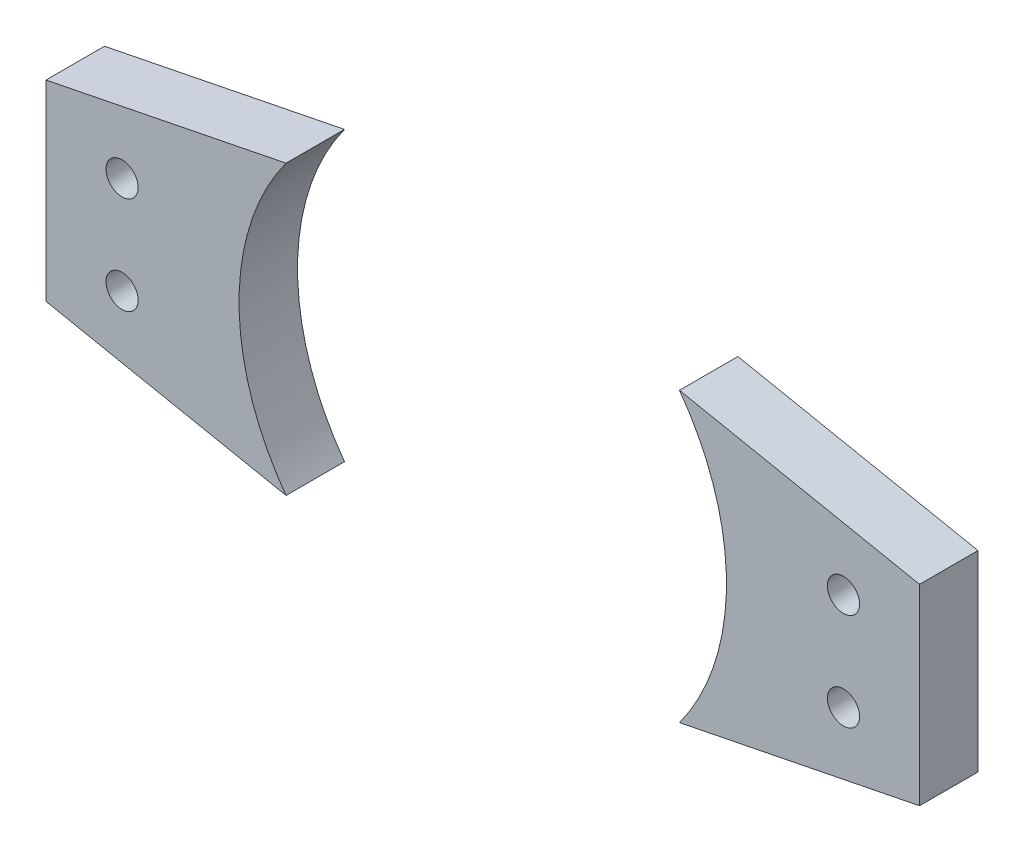
ISO-10303-21;
HEADER;
FILE_DESCRIPTION(('STEP AP214'),'2;1');
FILE_NAME('part.step','',(''),(''),'','','');
FILE_SCHEMA(('AUTOMOTIVE_DESIGN { 1 0 10303 214 1 1 1 1 }'));
ENDSEC;
DATA;
#1=APPLICATION_CONTEXT('core data for automotive mechanical design processes');
#2=APPLICATION_PROTOCOL_DEFINITION('international standard','automotive_design',2000,#1);
#3=PRODUCT_CONTEXT('',#1,'mechanical');
#4=PRODUCT('Part','Part','',(#3));
#5=PRODUCT_RELATED_PRODUCT_CATEGORY('part','',(#4));
#6=PRODUCT_DEFINITION_FORMATION('','',#4);
#7=PRODUCT_DEFINITION_CONTEXT('part definition',#1,'design');
#8=PRODUCT_DEFINITION('design','',#6,#7);
#9=PRODUCT_DEFINITION_SHAPE('','',#8);
#10=(LENGTH_UNIT() NAMED_UNIT(*) SI_UNIT(.MILLI.,.METRE.));
#11=(NAMED_UNIT(*) PLANE_ANGLE_UNIT() SI_UNIT($,.RADIAN.));
#12=(NAMED_UNIT(*) SI_UNIT($,.STERADIAN.) SOLID_ANGLE_UNIT());
#13=UNCERTAINTY_MEASURE_WITH_UNIT(LENGTH_MEASURE(1.E-05),#10,'distance_accuracy_value','');
#14=(GEOMETRIC_REPRESENTATION_CONTEXT(3) GLOBAL_UNCERTAINTY_ASSIGNED_CONTEXT((#13)) GLOBAL_UNIT_ASSIGNED_CONTEXT((#10,
#11,#12)) REPRESENTATION_CONTEXT('',''));
#15=CARTESIAN_POINT('',(0.,0.,0.));
#16=DIRECTION('',(0.,0.,1.));
#17=DIRECTION('',(1.,0.,0.));
#18=AXIS2_PLACEMENT_3D('',#15,#16,#17);
#19=CARTESIAN_POINT('',(15.,-50.,-106.));
#20=DIRECTION('',(0.,0.,-1.));
#21=DIRECTION('',(-1.,0.,0.));
#22=AXIS2_PLACEMENT_3D('',#19,#20,#21);
#23=PLANE('',#22);
#24=CARTESIAN_POINT('',(0.,-50.,-106.));
#25=DIRECTION('',(0.,0.,1.));
#26=DIRECTION('',(1.,0.,0.));
#27=AXIS2_PLACEMENT_3D('',#24,#25,#26);
#28=CIRCLE('',#27,25.);
#29=CARTESIAN_POINT('',(20.177354159453,-64.7605683875657,-106.));
#30=VERTEX_POINT('',#29);
#31=CARTESIAN_POINT('',(20.177354159453,-35.2394316124342,-106.));
#32=VERTEX_POINT('',#31);
#33=EDGE_CURVE('E57',#30,#32,#28,.T.);
#34=ORIENTED_EDGE('',*,*,#33,.T.);
#35=DIRECTION('',(0.98058067569092,-0.196116135138186,0.));
#36=VECTOR('',#35,1.);
#37=CARTESIAN_POINT('',(18.0376998498955,-34.8115007505227,-106.));
#38=LINE('',#37,#36);
#39=CARTESIAN_POINT('',(44.8,-40.1639607805437,-106.));
#40=VERTEX_POINT('',#39);
#41=EDGE_CURVE('E158',#32,#40,#38,.T.);
#42=ORIENTED_EDGE('',*,*,#41,.T.);
#43=DIRECTION('',(0.,-1.,0.));
#44=VECTOR('',#43,1.);
#45=CARTESIAN_POINT('',(44.8,-50.,-106.));
#46=LINE('',#45,#44);
#47=CARTESIAN_POINT('',(44.8,-59.8360392194563,-106.));
#48=VERTEX_POINT('',#47);
#49=EDGE_CURVE('E106',#40,#48,#46,.T.);
#50=ORIENTED_EDGE('',*,*,#49,.T.);
#51=DIRECTION('',(-0.98058067569092,-0.196116135138185,0.));
#52=VECTOR('',#51,1.);
#53=CARTESIAN_POINT('',(18.0376998498955,-65.1884992494772,-106.));
#54=LINE('',#53,#52);
#55=EDGE_CURVE('E114',#48,#30,#54,.T.);
#56=ORIENTED_EDGE('',*,*,#55,.T.);
#57=EDGE_LOOP('',(#34,#42,#50,#56));
#58=FACE_BOUND('',#57,.T.);
#59=CARTESIAN_POINT('',(37.,-55.,-106.));
#60=DIRECTION('',(0.,0.,-1.));
#61=DIRECTION('',(-1.,0.,0.));
#62=AXIS2_PLACEMENT_3D('',#59,#60,#61);
#63=CIRCLE('',#62,1.64999999999997);
#64=CARTESIAN_POINT('',(35.35,-55.,-106.));
#65=VERTEX_POINT('',#64);
#66=EDGE_CURVE('E123',#65,#65,#63,.T.);
#67=ORIENTED_EDGE('',*,*,#66,.F.);
#68=EDGE_LOOP('',(#67));
#69=FACE_BOUND('',#68,.T.);
#70=CARTESIAN_POINT('',(37.,-45.,-106.));
#71=DIRECTION('',(0.,0.,-1.));
#72=DIRECTION('',(-1.,0.,0.));
#73=AXIS2_PLACEMENT_3D('',#70,#71,#72);
#74=CIRCLE('',#73,1.64999999999997);
#75=CARTESIAN_POINT('',(35.35,-45.,-106.));
#76=VERTEX_POINT('',#75);
#77=EDGE_CURVE('E63',#76,#76,#74,.T.);
#78=ORIENTED_EDGE('',*,*,#77,.F.);
#79=EDGE_LOOP('',(#78));
#80=FACE_BOUND('',#79,.T.);
#81=ADVANCED_FACE('F53',(#58,#69,#80),#23,.T.);
#82=CARTESIAN_POINT('',(44.8,-50.,-100.));
#83=DIRECTION('',(1.,0.,0.));
#84=DIRECTION('',(0.,0.,-1.));
#85=AXIS2_PLACEMENT_3D('',#82,#83,#84);
#86=PLANE('',#85);
#87=ORIENTED_EDGE('',*,*,#49,.F.);
#88=DIRECTION('',(0.,0.,-1.));
#89=VECTOR('',#88,1.);
#90=CARTESIAN_POINT('',(44.8,-40.1639607805437,-100.));
#91=LINE('',#90,#89);
#92=CARTESIAN_POINT('',(44.8,-40.1639607805437,-100.));
#93=VERTEX_POINT('',#92);
#94=EDGE_CURVE('E96',#93,#40,#91,.T.);
#95=ORIENTED_EDGE('',*,*,#94,.F.);
#96=DIRECTION('',(0.,-1.,0.));
#97=VECTOR('',#96,1.);
#98=CARTESIAN_POINT('',(44.8,-50.,-100.));
#99=LINE('',#98,#97);
#100=CARTESIAN_POINT('',(44.8,-59.8360392194563,-100.));
#101=VERTEX_POINT('',#100);
#102=EDGE_CURVE('E104',#93,#101,#99,.T.);
#103=ORIENTED_EDGE('',*,*,#102,.T.);
#104=DIRECTION('',(0.,0.,-1.));
#105=VECTOR('',#104,1.);
#106=CARTESIAN_POINT('',(44.8,-59.8360392194563,-100.));
#107=LINE('',#106,#105);
#108=EDGE_CURVE('E87',#101,#48,#107,.T.);
#109=ORIENTED_EDGE('',*,*,#108,.T.);
#110=EDGE_LOOP('',(#87,#95,#103,#109));
#111=FACE_BOUND('',#110,.T.);
#112=ADVANCED_FACE('F103',(#111),#86,.T.);
#113=CARTESIAN_POINT('',(18.0376998498955,-34.8115007505227,-100.));
#114=DIRECTION('',(0.196116135138186,0.98058067569092,0.));
#115=DIRECTION('',(-0.98058067569092,0.196116135138186,0.));
#116=AXIS2_PLACEMENT_3D('',#113,#114,#115);
#117=PLANE('',#116);
#118=ORIENTED_EDGE('',*,*,#41,.F.);
#119=DIRECTION('',(0.,0.,-1.));
#120=VECTOR('',#119,1.);
#121=CARTESIAN_POINT('',(20.177354159453,-35.2394316124342,-100.));
#122=LINE('',#121,#120);
#123=CARTESIAN_POINT('',(20.177354159453,-35.2394316124342,-100.));
#124=VERTEX_POINT('',#123);
#125=EDGE_CURVE('E12',#124,#32,#122,.T.);
#126=ORIENTED_EDGE('',*,*,#125,.F.);
#127=DIRECTION('',(0.98058067569092,-0.196116135138186,0.));
#128=VECTOR('',#127,1.);
#129=CARTESIAN_POINT('',(18.0376998498955,-34.8115007505227,-100.));
#130=LINE('',#129,#128);
#131=EDGE_CURVE('E109',#124,#93,#130,.T.);
#132=ORIENTED_EDGE('',*,*,#131,.T.);
#133=ORIENTED_EDGE('',*,*,#94,.T.);
#134=EDGE_LOOP('',(#118,#126,#132,#133));
#135=FACE_BOUND('',#134,.T.);
#136=ADVANCED_FACE('F116',(#135),#117,.T.);
#137=CARTESIAN_POINT('',(18.0376998498955,-65.1884992494772,-100.));
#138=DIRECTION('',(0.196116135138185,-0.98058067569092,0.));
#139=DIRECTION('',(0.98058067569092,0.196116135138185,0.));
#140=AXIS2_PLACEMENT_3D('',#137,#138,#139);
#141=PLANE('',#140);
#142=ORIENTED_EDGE('',*,*,#55,.F.);
#143=ORIENTED_EDGE('',*,*,#108,.F.);
#144=DIRECTION('',(-0.98058067569092,-0.196116135138185,0.));
#145=VECTOR('',#144,1.);
#146=CARTESIAN_POINT('',(18.0376998498955,-65.1884992494772,-100.));
#147=LINE('',#146,#145);
#148=CARTESIAN_POINT('',(20.177354159453,-64.7605683875657,-100.));
#149=VERTEX_POINT('',#148);
#150=EDGE_CURVE('E108',#101,#149,#147,.T.);
#151=ORIENTED_EDGE('',*,*,#150,.T.);
#152=DIRECTION('',(0.,0.,-1.));
#153=VECTOR('',#152,1.);
#154=CARTESIAN_POINT('',(20.177354159453,-64.7605683875657,-100.));
#155=LINE('',#154,#153);
#156=EDGE_CURVE('E125',#149,#30,#155,.T.);
#157=ORIENTED_EDGE('',*,*,#156,.T.);
#158=EDGE_LOOP('',(#142,#143,#151,#157));
#159=FACE_BOUND('',#158,.T.);
#160=ADVANCED_FACE('F150',(#159),#141,.T.);
#161=CARTESIAN_POINT('',(0.,-50.,-100.));
#162=DIRECTION('',(0.,0.,-1.));
#163=DIRECTION('',(-1.,0.,0.));
#164=AXIS2_PLACEMENT_3D('',#161,#162,#163);
#165=PLANE('',#164);
#166=CARTESIAN_POINT('',(37.,-45.,-100.));
#167=DIRECTION('',(0.,0.,-1.));
#168=DIRECTION('',(-1.,0.,0.));
#169=AXIS2_PLACEMENT_3D('',#166,#167,#168);
#170=CIRCLE('',#169,1.64999999999996);
#171=CARTESIAN_POINT('',(35.35,-45.,-100.));
#172=VERTEX_POINT('',#171);
#173=EDGE_CURVE('E161',#172,#172,#170,.T.);
#174=ORIENTED_EDGE('',*,*,#173,.T.);
#175=EDGE_LOOP('',(#174));
#176=FACE_BOUND('',#175,.T.);
#177=CARTESIAN_POINT('',(37.,-55.,-100.));
#178=DIRECTION('',(0.,0.,-1.));
#179=DIRECTION('',(-1.,0.,0.));
#180=AXIS2_PLACEMENT_3D('',#177,#178,#179);
#181=CIRCLE('',#180,1.64999999999996);
#182=CARTESIAN_POINT('',(35.35,-55.,-100.));
#183=VERTEX_POINT('',#182);
#184=EDGE_CURVE('E124',#183,#183,#181,.T.);
#185=ORIENTED_EDGE('',*,*,#184,.T.);
#186=EDGE_LOOP('',(#185));
#187=FACE_BOUND('',#186,.T.);
#188=ORIENTED_EDGE('',*,*,#102,.F.);
#189=ORIENTED_EDGE('',*,*,#131,.F.);
#190=CARTESIAN_POINT('',(0.,-50.,-100.));
#191=DIRECTION('',(0.,0.,-1.));
#192=DIRECTION('',(-1.,0.,0.));
#193=AXIS2_PLACEMENT_3D('',#190,#191,#192);
#194=CIRCLE('',#193,25.);
#195=EDGE_CURVE('E71',#124,#149,#194,.T.);
#196=ORIENTED_EDGE('',*,*,#195,.T.);
#197=ORIENTED_EDGE('',*,*,#150,.F.);
#198=EDGE_LOOP('',(#188,#189,#196,#197));
#199=FACE_BOUND('',#198,.T.);
#200=ADVANCED_FACE('F113',(#176,#187,#199),#165,.F.);
#201=CARTESIAN_POINT('',(37.,-55.,-106.));
#202=DIRECTION('',(0.,0.,-1.));
#203=DIRECTION('',(-1.,0.,0.));
#204=AXIS2_PLACEMENT_3D('',#201,#202,#203);
#205=CYLINDRICAL_SURFACE('',#204,1.64999999999996);
#206=ORIENTED_EDGE('',*,*,#66,.T.);
#207=EDGE_LOOP('',(#206));
#208=FACE_BOUND('',#207,.T.);
#209=ORIENTED_EDGE('',*,*,#184,.F.);
#210=EDGE_LOOP('',(#209));
#211=FACE_BOUND('',#210,.T.);
#212=ADVANCED_FACE('F144',(#208,#211),#205,.F.);
#213=CARTESIAN_POINT('',(37.,-45.,-106.));
#214=DIRECTION('',(0.,0.,-1.));
#215=DIRECTION('',(-1.,0.,0.));
#216=AXIS2_PLACEMENT_3D('',#213,#214,#215);
#217=CYLINDRICAL_SURFACE('',#216,1.64999999999996);
#218=ORIENTED_EDGE('',*,*,#77,.T.);
#219=EDGE_LOOP('',(#218));
#220=FACE_BOUND('',#219,.T.);
#221=ORIENTED_EDGE('',*,*,#173,.F.);
#222=EDGE_LOOP('',(#221));
#223=FACE_BOUND('',#222,.T.);
#224=ADVANCED_FACE('F131',(#220,#223),#217,.F.);
#225=CARTESIAN_POINT('',(0.,-50.,-106.));
#226=DIRECTION('',(0.,0.,1.));
#227=DIRECTION('',(1.,0.,0.));
#228=AXIS2_PLACEMENT_3D('',#225,#226,#227);
#229=CYLINDRICAL_SURFACE('',#228,25.);
#230=ORIENTED_EDGE('',*,*,#125,.T.);
#231=ORIENTED_EDGE('',*,*,#33,.F.);
#232=ORIENTED_EDGE('',*,*,#156,.F.);
#233=ORIENTED_EDGE('',*,*,#195,.F.);
#234=EDGE_LOOP('',(#230,#231,#232,#233));
#235=FACE_BOUND('',#234,.T.);
#236=ADVANCED_FACE('F55',(#235),#229,.F.);
#237=CLOSED_SHELL('',(#81,#112,#136,#160,#200,#212,#224,#236));
#238=MANIFOLD_SOLID_BREP('B2',#237);
#239=CARTESIAN_POINT('',(-44.8,-50.,-100.));
#240=DIRECTION('',(1.,0.,0.));
#241=DIRECTION('',(0.,0.,-1.));
#242=AXIS2_PLACEMENT_3D('',#239,#240,#241);
#243=PLANE('',#242);
#244=DIRECTION('',(0.,-1.,0.));
#245=VECTOR('',#244,1.);
#246=CARTESIAN_POINT('',(-44.8,-50.,-106.));
#247=LINE('',#246,#245);
#248=CARTESIAN_POINT('',(-44.8,-40.1639607805437,-106.));
#249=VERTEX_POINT('',#248);
#250=CARTESIAN_POINT('',(-44.8,-59.8360392194563,-106.));
#251=VERTEX_POINT('',#250);
#252=EDGE_CURVE('E279',#249,#251,#247,.T.);
#253=ORIENTED_EDGE('',*,*,#252,.T.);
#254=DIRECTION('',(0.,0.,-1.));
#255=VECTOR('',#254,1.);
#256=CARTESIAN_POINT('',(-44.8,-59.8360392194563,-100.));
#257=LINE('',#256,#255);
#258=CARTESIAN_POINT('',(-44.8,-59.8360392194563,-100.));
#259=VERTEX_POINT('',#258);
#260=EDGE_CURVE('E281',#259,#251,#257,.T.);
#261=ORIENTED_EDGE('',*,*,#260,.F.);
#262=DIRECTION('',(0.,-1.,0.));
#263=VECTOR('',#262,1.);
#264=CARTESIAN_POINT('',(-44.8,-50.,-100.));
#265=LINE('',#264,#263);
#266=CARTESIAN_POINT('',(-44.8,-40.1639607805437,-100.));
#267=VERTEX_POINT('',#266);
#268=EDGE_CURVE('E266',#267,#259,#265,.T.);
#269=ORIENTED_EDGE('',*,*,#268,.F.);
#270=DIRECTION('',(0.,0.,-1.));
#271=VECTOR('',#270,1.);
#272=CARTESIAN_POINT('',(-44.8,-40.1639607805437,-100.));
#273=LINE('',#272,#271);
#274=EDGE_CURVE('E284',#267,#249,#273,.T.);
#275=ORIENTED_EDGE('',*,*,#274,.T.);
#276=EDGE_LOOP('',(#253,#261,#269,#275));
#277=FACE_BOUND('',#276,.T.);
#278=ADVANCED_FACE('F241',(#277),#243,.F.);
#279=CARTESIAN_POINT('',(-37.,-55.,-106.));
#280=DIRECTION('',(0.,0.,-1.));
#281=DIRECTION('',(-1.,0.,0.));
#282=AXIS2_PLACEMENT_3D('',#279,#280,#281);
#283=CYLINDRICAL_SURFACE('',#282,1.64999999999996);
#284=CARTESIAN_POINT('',(-37.,-55.,-106.));
#285=DIRECTION('',(0.,0.,-1.));
#286=DIRECTION('',(-1.,0.,0.));
#287=AXIS2_PLACEMENT_3D('',#284,#285,#286);
#288=CIRCLE('',#287,1.64999999999997);
#289=CARTESIAN_POINT('',(-38.65,-55.,-106.));
#290=VERTEX_POINT('',#289);
#291=EDGE_CURVE('E305',#290,#290,#288,.T.);
#292=ORIENTED_EDGE('',*,*,#291,.T.);
#293=EDGE_LOOP('',(#292));
#294=FACE_BOUND('',#293,.T.);
#295=CARTESIAN_POINT('',(-37.,-55.,-100.));
#296=DIRECTION('',(0.,0.,-1.));
#297=DIRECTION('',(-1.,0.,0.));
#298=AXIS2_PLACEMENT_3D('',#295,#296,#297);
#299=CIRCLE('',#298,1.64999999999996);
#300=CARTESIAN_POINT('',(-38.65,-55.,-100.));
#301=VERTEX_POINT('',#300);
#302=EDGE_CURVE('E301',#301,#301,#299,.T.);
#303=ORIENTED_EDGE('',*,*,#302,.F.);
#304=EDGE_LOOP('',(#303));
#305=FACE_BOUND('',#304,.T.);
#306=ADVANCED_FACE('F337',(#294,#305),#283,.F.);
#307=CARTESIAN_POINT('',(-37.,-45.,-106.));
#308=DIRECTION('',(0.,0.,-1.));
#309=DIRECTION('',(-1.,0.,0.));
#310=AXIS2_PLACEMENT_3D('',#307,#308,#309);
#311=CYLINDRICAL_SURFACE('',#310,1.64999999999996);
#312=CARTESIAN_POINT('',(-37.,-45.,-106.));
#313=DIRECTION('',(0.,0.,-1.));
#314=DIRECTION('',(-1.,0.,0.));
#315=AXIS2_PLACEMENT_3D('',#312,#313,#314);
#316=CIRCLE('',#315,1.64999999999997);
#317=CARTESIAN_POINT('',(-38.65,-45.,-106.));
#318=VERTEX_POINT('',#317);
#319=EDGE_CURVE('E325',#318,#318,#316,.T.);
#320=ORIENTED_EDGE('',*,*,#319,.T.);
#321=EDGE_LOOP('',(#320));
#322=FACE_BOUND('',#321,.T.);
#323=CARTESIAN_POINT('',(-37.,-45.,-100.));
#324=DIRECTION('',(0.,0.,-1.));
#325=DIRECTION('',(-1.,0.,0.));
#326=AXIS2_PLACEMENT_3D('',#323,#324,#325);
#327=CIRCLE('',#326,1.64999999999996);
#328=CARTESIAN_POINT('',(-38.65,-45.,-100.));
#329=VERTEX_POINT('',#328);
#330=EDGE_CURVE('E245',#329,#329,#327,.T.);
#331=ORIENTED_EDGE('',*,*,#330,.F.);
#332=EDGE_LOOP('',(#331));
#333=FACE_BOUND('',#332,.T.);
#334=ADVANCED_FACE('F335',(#322,#333),#311,.F.);
#335=CARTESIAN_POINT('',(0.,-50.,-100.));
#336=DIRECTION('',(0.,0.,-1.));
#337=DIRECTION('',(-1.,0.,0.));
#338=AXIS2_PLACEMENT_3D('',#335,#336,#337);
#339=PLANE('',#338);
#340=ORIENTED_EDGE('',*,*,#330,.T.);
#341=EDGE_LOOP('',(#340));
#342=FACE_BOUND('',#341,.T.);
#343=ORIENTED_EDGE('',*,*,#302,.T.);
#344=EDGE_LOOP('',(#343));
#345=FACE_BOUND('',#344,.T.);
#346=DIRECTION('',(0.98058067569092,-0.196116135138185,0.));
#347=VECTOR('',#346,1.);
#348=CARTESIAN_POINT('',(10.8084539962584,-70.957730018708,-100.));
#349=LINE('',#348,#347);
#350=CARTESIAN_POINT('',(-20.177354159453,-64.7605683875657,-100.));
#351=VERTEX_POINT('',#350);
#352=EDGE_CURVE('E288',#259,#351,#349,.T.);
#353=ORIENTED_EDGE('',*,*,#352,.T.);
#354=CARTESIAN_POINT('',(0.,-50.,-100.));
#355=DIRECTION('',(0.,0.,-1.));
#356=DIRECTION('',(-1.,0.,0.));
#357=AXIS2_PLACEMENT_3D('',#354,#355,#356);
#358=CIRCLE('',#357,25.);
#359=CARTESIAN_POINT('',(-20.177354159453,-35.2394316124343,-100.));
#360=VERTEX_POINT('',#359);
#361=EDGE_CURVE('E317',#351,#360,#358,.T.);
#362=ORIENTED_EDGE('',*,*,#361,.T.);
#363=DIRECTION('',(-0.98058067569092,-0.196116135138186,0.));
#364=VECTOR('',#363,1.);
#365=CARTESIAN_POINT('',(10.8084539962583,-29.0422699812919,-100.));
#366=LINE('',#365,#364);
#367=EDGE_CURVE('E314',#360,#267,#366,.T.);
#368=ORIENTED_EDGE('',*,*,#367,.T.);
#369=ORIENTED_EDGE('',*,*,#268,.T.);
#370=EDGE_LOOP('',(#353,#362,#368,#369));
#371=FACE_BOUND('',#370,.T.);
#372=ADVANCED_FACE('F320',(#342,#345,#371),#339,.F.);
#373=CARTESIAN_POINT('',(10.8084539962583,-29.0422699812919,-100.));
#374=DIRECTION('',(0.196116135138186,-0.98058067569092,0.));
#375=DIRECTION('',(0.98058067569092,0.196116135138186,0.));
#376=AXIS2_PLACEMENT_3D('',#373,#374,#375);
#377=PLANE('',#376);
#378=DIRECTION('',(-0.98058067569092,-0.196116135138186,0.));
#379=VECTOR('',#378,1.);
#380=CARTESIAN_POINT('',(10.8084539962583,-29.0422699812919,-106.));
#381=LINE('',#380,#379);
#382=CARTESIAN_POINT('',(-20.177354159453,-35.2394316124342,-106.));
#383=VERTEX_POINT('',#382);
#384=EDGE_CURVE('E289',#383,#249,#381,.T.);
#385=ORIENTED_EDGE('',*,*,#384,.T.);
#386=ORIENTED_EDGE('',*,*,#274,.F.);
#387=ORIENTED_EDGE('',*,*,#367,.F.);
#388=DIRECTION('',(0.,0.,-1.));
#389=VECTOR('',#388,1.);
#390=CARTESIAN_POINT('',(-20.177354159453,-35.2394316124343,-100.));
#391=LINE('',#390,#389);
#392=EDGE_CURVE('E250',#360,#383,#391,.T.);
#393=ORIENTED_EDGE('',*,*,#392,.T.);
#394=EDGE_LOOP('',(#385,#386,#387,#393));
#395=FACE_BOUND('',#394,.T.);
#396=ADVANCED_FACE('F313',(#395),#377,.F.);
#397=CARTESIAN_POINT('',(10.8084539962584,-70.957730018708,-100.));
#398=DIRECTION('',(0.196116135138185,0.98058067569092,0.));
#399=DIRECTION('',(-0.98058067569092,0.196116135138185,0.));
#400=AXIS2_PLACEMENT_3D('',#397,#398,#399);
#401=PLANE('',#400);
#402=DIRECTION('',(0.98058067569092,-0.196116135138185,0.));
#403=VECTOR('',#402,1.);
#404=CARTESIAN_POINT('',(10.8084539962584,-70.957730018708,-106.));
#405=LINE('',#404,#403);
#406=CARTESIAN_POINT('',(-20.177354159453,-64.7605683875657,-106.));
#407=VERTEX_POINT('',#406);
#408=EDGE_CURVE('E296',#251,#407,#405,.T.);
#409=ORIENTED_EDGE('',*,*,#408,.T.);
#410=DIRECTION('',(0.,0.,-1.));
#411=VECTOR('',#410,1.);
#412=CARTESIAN_POINT('',(-20.177354159453,-64.7605683875658,-100.));
#413=LINE('',#412,#411);
#414=EDGE_CURVE('E51',#351,#407,#413,.T.);
#415=ORIENTED_EDGE('',*,*,#414,.F.);
#416=ORIENTED_EDGE('',*,*,#352,.F.);
#417=ORIENTED_EDGE('',*,*,#260,.T.);
#418=EDGE_LOOP('',(#409,#415,#416,#417));
#419=FACE_BOUND('',#418,.T.);
#420=ADVANCED_FACE('F293',(#419),#401,.F.);
#421=CARTESIAN_POINT('',(15.,-50.,-106.));
#422=DIRECTION('',(0.,0.,-1.));
#423=DIRECTION('',(-1.,0.,0.));
#424=AXIS2_PLACEMENT_3D('',#421,#422,#423);
#425=PLANE('',#424);
#426=CARTESIAN_POINT('',(0.,-50.,-106.));
#427=DIRECTION('',(0.,0.,1.));
#428=DIRECTION('',(1.,0.,0.));
#429=AXIS2_PLACEMENT_3D('',#426,#427,#428);
#430=CIRCLE('',#429,25.);
#431=EDGE_CURVE('E300',#383,#407,#430,.T.);
#432=ORIENTED_EDGE('',*,*,#431,.T.);
#433=ORIENTED_EDGE('',*,*,#408,.F.);
#434=ORIENTED_EDGE('',*,*,#252,.F.);
#435=ORIENTED_EDGE('',*,*,#384,.F.);
#436=EDGE_LOOP('',(#432,#433,#434,#435));
#437=FACE_BOUND('',#436,.T.);
#438=ORIENTED_EDGE('',*,*,#319,.F.);
#439=EDGE_LOOP('',(#438));
#440=FACE_BOUND('',#439,.T.);
#441=ORIENTED_EDGE('',*,*,#291,.F.);
#442=EDGE_LOOP('',(#441));
#443=FACE_BOUND('',#442,.T.);
#444=ADVANCED_FACE('F243',(#437,#440,#443),#425,.T.);
#445=CARTESIAN_POINT('',(0.,-50.,-106.));
#446=DIRECTION('',(0.,0.,1.));
#447=DIRECTION('',(1.,0.,0.));
#448=AXIS2_PLACEMENT_3D('',#445,#446,#447);
#449=CYLINDRICAL_SURFACE('',#448,25.);
#450=ORIENTED_EDGE('',*,*,#431,.F.);
#451=ORIENTED_EDGE('',*,*,#392,.F.);
#452=ORIENTED_EDGE('',*,*,#361,.F.);
#453=ORIENTED_EDGE('',*,*,#414,.T.);
#454=EDGE_LOOP('',(#450,#451,#452,#453));
#455=FACE_BOUND('',#454,.T.);
#456=ADVANCED_FACE('F318',(#455),#449,.F.);
#457=CLOSED_SHELL('',(#278,#306,#334,#372,#396,#420,#444,#456));
#458=MANIFOLD_SOLID_BREP('B6',#457);
#459=ADVANCED_BREP_SHAPE_REPRESENTATION('',(#18,#238,#458),#14);
#460=SHAPE_DEFINITION_REPRESENTATION(#9,#459);
ENDSEC;
END-ISO-10303-21;
